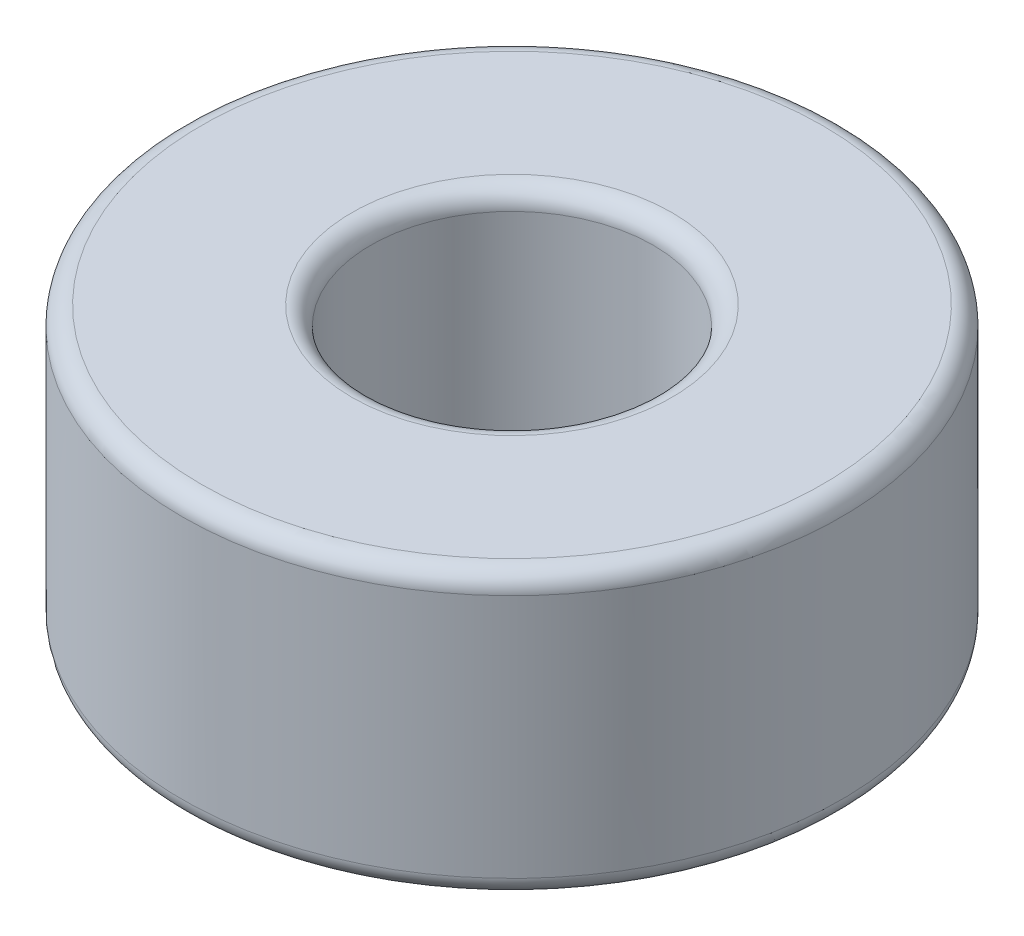
ISO-10303-21;
HEADER;
FILE_DESCRIPTION(('STEP AP214'),'2;1');
FILE_NAME('part.step','',(''),(''),'','','');
FILE_SCHEMA(('AUTOMOTIVE_DESIGN { 1 0 10303 214 1 1 1 1 }'));
ENDSEC;
DATA;
#1=APPLICATION_CONTEXT('core data for automotive mechanical design processes');
#2=APPLICATION_PROTOCOL_DEFINITION('international standard','automotive_design',2000,#1);
#3=PRODUCT_CONTEXT('',#1,'mechanical');
#4=PRODUCT('Part','Part','',(#3));
#5=PRODUCT_RELATED_PRODUCT_CATEGORY('part','',(#4));
#6=PRODUCT_DEFINITION_FORMATION('','',#4);
#7=PRODUCT_DEFINITION_CONTEXT('part definition',#1,'design');
#8=PRODUCT_DEFINITION('design','',#6,#7);
#9=PRODUCT_DEFINITION_SHAPE('','',#8);
#10=(LENGTH_UNIT() NAMED_UNIT(*) SI_UNIT(.MILLI.,.METRE.));
#11=(NAMED_UNIT(*) PLANE_ANGLE_UNIT() SI_UNIT($,.RADIAN.));
#12=(NAMED_UNIT(*) SI_UNIT($,.STERADIAN.) SOLID_ANGLE_UNIT());
#13=UNCERTAINTY_MEASURE_WITH_UNIT(LENGTH_MEASURE(1.E-05),#10,'distance_accuracy_value','');
#14=(GEOMETRIC_REPRESENTATION_CONTEXT(3) GLOBAL_UNCERTAINTY_ASSIGNED_CONTEXT((#13)) GLOBAL_UNIT_ASSIGNED_CONTEXT((#10,
#11,#12)) REPRESENTATION_CONTEXT('',''));
#15=CARTESIAN_POINT('',(0.,0.,0.));
#16=DIRECTION('',(0.,0.,1.));
#17=DIRECTION('',(1.,0.,0.));
#18=AXIS2_PLACEMENT_3D('',#15,#16,#17);
#19=CARTESIAN_POINT('',(0.,0.,0.));
#20=DIRECTION('',(0.,-1.,0.));
#21=DIRECTION('',(0.,0.,-1.));
#22=AXIS2_PLACEMENT_3D('',#19,#20,#21);
#23=CYLINDRICAL_SURFACE('',#22,1.5);
#24=CARTESIAN_POINT('',(0.,0.2,0.));
#25=DIRECTION('',(0.,-1.,0.));
#26=DIRECTION('',(0.,0.,-1.));
#27=AXIS2_PLACEMENT_3D('',#24,#25,#26);
#28=CIRCLE('',#27,1.5);
#29=CARTESIAN_POINT('',(0.,0.2,-1.5));
#30=VERTEX_POINT('',#29);
#31=EDGE_CURVE('E59',#30,#30,#28,.T.);
#32=ORIENTED_EDGE('',*,*,#31,.T.);
#33=EDGE_LOOP('',(#32));
#34=FACE_BOUND('',#33,.T.);
#35=CARTESIAN_POINT('',(0.,2.8,0.));
#36=DIRECTION('',(0.,1.,0.));
#37=DIRECTION('',(0.,0.,1.));
#38=AXIS2_PLACEMENT_3D('',#35,#36,#37);
#39=CIRCLE('',#38,1.5);
#40=CARTESIAN_POINT('',(0.,2.8,1.5));
#41=VERTEX_POINT('',#40);
#42=EDGE_CURVE('E62',#41,#41,#39,.T.);
#43=ORIENTED_EDGE('',*,*,#42,.T.);
#44=EDGE_LOOP('',(#43));
#45=FACE_BOUND('',#44,.T.);
#46=ADVANCED_FACE('F33',(#34,#45),#23,.F.);
#47=CARTESIAN_POINT('',(1.5,3.,0.));
#48=DIRECTION('',(0.,1.,0.));
#49=DIRECTION('',(0.,0.,1.));
#50=AXIS2_PLACEMENT_3D('',#47,#48,#49);
#51=PLANE('',#50);
#52=CARTESIAN_POINT('',(0.,3.,0.));
#53=DIRECTION('',(0.,1.,0.));
#54=DIRECTION('',(0.,0.,1.));
#55=AXIS2_PLACEMENT_3D('',#52,#53,#54);
#56=CIRCLE('',#55,3.3);
#57=CARTESIAN_POINT('',(0.,3.,3.3));
#58=VERTEX_POINT('',#57);
#59=EDGE_CURVE('E10',#58,#58,#56,.T.);
#60=ORIENTED_EDGE('',*,*,#59,.T.);
#61=EDGE_LOOP('',(#60));
#62=FACE_BOUND('',#61,.T.);
#63=CARTESIAN_POINT('',(0.,3.,0.));
#64=DIRECTION('',(0.,1.,0.));
#65=DIRECTION('',(0.,0.,1.));
#66=AXIS2_PLACEMENT_3D('',#63,#64,#65);
#67=CIRCLE('',#66,1.7);
#68=CARTESIAN_POINT('',(0.,3.,1.7));
#69=VERTEX_POINT('',#68);
#70=EDGE_CURVE('E40',#69,#69,#67,.F.);
#71=ORIENTED_EDGE('',*,*,#70,.T.);
#72=EDGE_LOOP('',(#71));
#73=FACE_BOUND('',#72,.T.);
#74=ADVANCED_FACE('F76',(#62,#73),#51,.T.);
#75=CARTESIAN_POINT('',(0.,0.,0.));
#76=DIRECTION('',(0.,-1.,0.));
#77=DIRECTION('',(0.,0.,-1.));
#78=AXIS2_PLACEMENT_3D('',#75,#76,#77);
#79=CYLINDRICAL_SURFACE('',#78,3.5);
#80=CARTESIAN_POINT('',(0.,0.2,0.));
#81=DIRECTION('',(0.,-1.,0.));
#82=DIRECTION('',(0.,0.,-1.));
#83=AXIS2_PLACEMENT_3D('',#80,#81,#82);
#84=CIRCLE('',#83,3.5);
#85=CARTESIAN_POINT('',(0.,0.2,-3.5));
#86=VERTEX_POINT('',#85);
#87=EDGE_CURVE('E44',#86,#86,#84,.F.);
#88=ORIENTED_EDGE('',*,*,#87,.T.);
#89=EDGE_LOOP('',(#88));
#90=FACE_BOUND('',#89,.T.);
#91=CARTESIAN_POINT('',(0.,2.8,0.));
#92=DIRECTION('',(0.,1.,0.));
#93=DIRECTION('',(0.,0.,1.));
#94=AXIS2_PLACEMENT_3D('',#91,#92,#93);
#95=CIRCLE('',#94,3.5);
#96=CARTESIAN_POINT('',(0.,2.8,3.5));
#97=VERTEX_POINT('',#96);
#98=EDGE_CURVE('E48',#97,#97,#95,.F.);
#99=ORIENTED_EDGE('',*,*,#98,.T.);
#100=EDGE_LOOP('',(#99));
#101=FACE_BOUND('',#100,.T.);
#102=ADVANCED_FACE('F82',(#90,#101),#79,.T.);
#103=CARTESIAN_POINT('',(1.5,0.,0.));
#104=DIRECTION('',(0.,-1.,0.));
#105=DIRECTION('',(0.,0.,-1.));
#106=AXIS2_PLACEMENT_3D('',#103,#104,#105);
#107=PLANE('',#106);
#108=CARTESIAN_POINT('',(0.,0.,0.));
#109=DIRECTION('',(0.,-1.,0.));
#110=DIRECTION('',(0.,0.,-1.));
#111=AXIS2_PLACEMENT_3D('',#108,#109,#110);
#112=CIRCLE('',#111,1.7);
#113=CARTESIAN_POINT('',(0.,0.,-1.7));
#114=VERTEX_POINT('',#113);
#115=EDGE_CURVE('E53',#114,#114,#112,.F.);
#116=ORIENTED_EDGE('',*,*,#115,.T.);
#117=EDGE_LOOP('',(#116));
#118=FACE_BOUND('',#117,.T.);
#119=CARTESIAN_POINT('',(0.,0.,0.));
#120=DIRECTION('',(0.,-1.,0.));
#121=DIRECTION('',(0.,0.,-1.));
#122=AXIS2_PLACEMENT_3D('',#119,#120,#121);
#123=CIRCLE('',#122,3.3);
#124=CARTESIAN_POINT('',(0.,0.,-3.3));
#125=VERTEX_POINT('',#124);
#126=EDGE_CURVE('E56',#125,#125,#123,.T.);
#127=ORIENTED_EDGE('',*,*,#126,.T.);
#128=EDGE_LOOP('',(#127));
#129=FACE_BOUND('',#128,.T.);
#130=ADVANCED_FACE('F89',(#118,#129),#107,.T.);
#131=CARTESIAN_POINT('',(0.,0.2,0.));
#132=DIRECTION('',(0.,-1.,0.));
#133=DIRECTION('',(0.,0.,-1.));
#134=AXIS2_PLACEMENT_3D('',#131,#132,#133);
#135=TOROIDAL_SURFACE('',#134,1.7,0.2);
#136=ORIENTED_EDGE('',*,*,#115,.F.);
#137=EDGE_LOOP('',(#136));
#138=FACE_BOUND('',#137,.T.);
#139=ORIENTED_EDGE('',*,*,#31,.F.);
#140=EDGE_LOOP('',(#139));
#141=FACE_BOUND('',#140,.T.);
#142=ADVANCED_FACE('F86',(#138,#141),#135,.T.);
#143=CARTESIAN_POINT('',(0.,0.2,0.));
#144=DIRECTION('',(0.,-1.,0.));
#145=DIRECTION('',(0.,0.,-1.));
#146=AXIS2_PLACEMENT_3D('',#143,#144,#145);
#147=TOROIDAL_SURFACE('',#146,3.3,0.2);
#148=ORIENTED_EDGE('',*,*,#87,.F.);
#149=EDGE_LOOP('',(#148));
#150=FACE_BOUND('',#149,.T.);
#151=ORIENTED_EDGE('',*,*,#126,.F.);
#152=EDGE_LOOP('',(#151));
#153=FACE_BOUND('',#152,.T.);
#154=ADVANCED_FACE('F73',(#150,#153),#147,.T.);
#155=CARTESIAN_POINT('',(0.,2.8,0.));
#156=DIRECTION('',(0.,1.,0.));
#157=DIRECTION('',(0.,0.,1.));
#158=AXIS2_PLACEMENT_3D('',#155,#156,#157);
#159=TOROIDAL_SURFACE('',#158,3.3,0.2);
#160=ORIENTED_EDGE('',*,*,#59,.F.);
#161=EDGE_LOOP('',(#160));
#162=FACE_BOUND('',#161,.T.);
#163=ORIENTED_EDGE('',*,*,#98,.F.);
#164=EDGE_LOOP('',(#163));
#165=FACE_BOUND('',#164,.T.);
#166=ADVANCED_FACE('F69',(#162,#165),#159,.T.);
#167=CARTESIAN_POINT('',(0.,2.8,0.));
#168=DIRECTION('',(0.,1.,0.));
#169=DIRECTION('',(0.,0.,1.));
#170=AXIS2_PLACEMENT_3D('',#167,#168,#169);
#171=TOROIDAL_SURFACE('',#170,1.7,0.2);
#172=ORIENTED_EDGE('',*,*,#42,.F.);
#173=EDGE_LOOP('',(#172));
#174=FACE_BOUND('',#173,.T.);
#175=ORIENTED_EDGE('',*,*,#70,.F.);
#176=EDGE_LOOP('',(#175));
#177=FACE_BOUND('',#176,.T.);
#178=ADVANCED_FACE('F35',(#174,#177),#171,.T.);
#179=CLOSED_SHELL('',(#46,#74,#102,#130,#142,#154,#166,#178));
#180=MANIFOLD_SOLID_BREP('B2',#179);
#181=ADVANCED_BREP_SHAPE_REPRESENTATION('',(#18,#180),#14);
#182=SHAPE_DEFINITION_REPRESENTATION(#9,#181);
ENDSEC;
END-ISO-10303-21;
